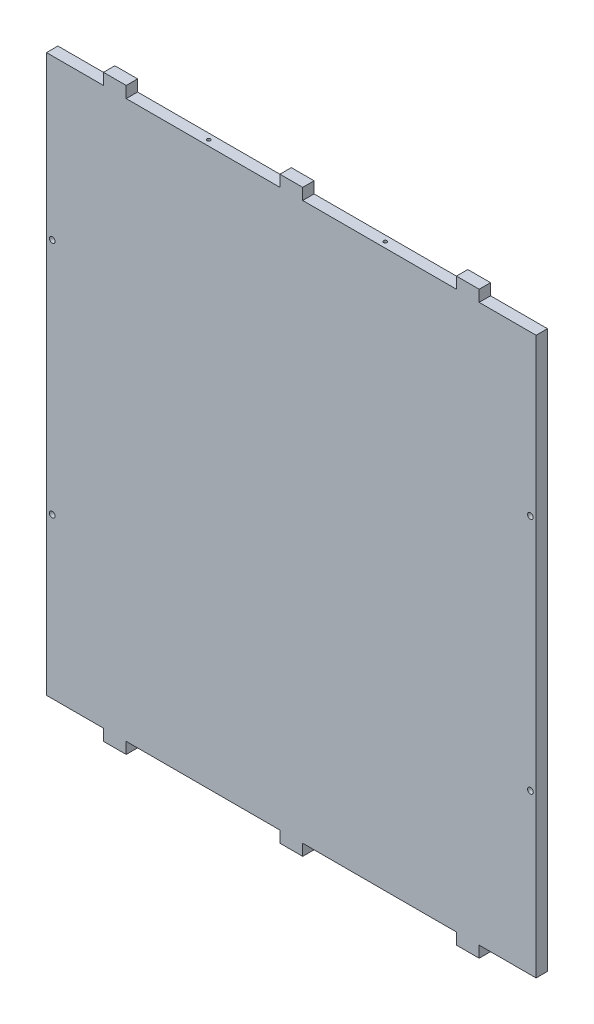
ISO-10303-21;
HEADER;
FILE_DESCRIPTION(('STEP AP214'),'2;1');
FILE_NAME('part.step','',(''),(''),'','','');
FILE_SCHEMA(('AUTOMOTIVE_DESIGN { 1 0 10303 214 1 1 1 1 }'));
ENDSEC;
DATA;
#1=APPLICATION_CONTEXT('core data for automotive mechanical design processes');
#2=APPLICATION_PROTOCOL_DEFINITION('international standard','automotive_design',2000,#1);
#3=PRODUCT_CONTEXT('',#1,'mechanical');
#4=PRODUCT('Part','Part','',(#3));
#5=PRODUCT_RELATED_PRODUCT_CATEGORY('part','',(#4));
#6=PRODUCT_DEFINITION_FORMATION('','',#4);
#7=PRODUCT_DEFINITION_CONTEXT('part definition',#1,'design');
#8=PRODUCT_DEFINITION('design','',#6,#7);
#9=PRODUCT_DEFINITION_SHAPE('','',#8);
#10=(LENGTH_UNIT() NAMED_UNIT(*) SI_UNIT(.MILLI.,.METRE.));
#11=(NAMED_UNIT(*) PLANE_ANGLE_UNIT() SI_UNIT($,.RADIAN.));
#12=(NAMED_UNIT(*) SI_UNIT($,.STERADIAN.) SOLID_ANGLE_UNIT());
#13=UNCERTAINTY_MEASURE_WITH_UNIT(LENGTH_MEASURE(1.E-05),#10,'distance_accuracy_value','');
#14=(GEOMETRIC_REPRESENTATION_CONTEXT(3) GLOBAL_UNCERTAINTY_ASSIGNED_CONTEXT((#13)) GLOBAL_UNIT_ASSIGNED_CONTEXT((#10,
#11,#12)) REPRESENTATION_CONTEXT('',''));
#15=CARTESIAN_POINT('',(0.,0.,0.));
#16=DIRECTION('',(0.,0.,1.));
#17=DIRECTION('',(1.,0.,0.));
#18=AXIS2_PLACEMENT_3D('',#15,#16,#17);
#19=CARTESIAN_POINT('',(30.5,177.225,5.));
#20=DIRECTION('',(0.,1.,0.));
#21=DIRECTION('',(0.,0.,1.));
#22=AXIS2_PLACEMENT_3D('',#19,#20,#21);
#23=PLANE('',#22);
#24=DIRECTION('',(0.,0.,1.));
#25=VECTOR('',#24,1.);
#26=CARTESIAN_POINT('',(-84.9999999999999,177.225,0.));
#27=LINE('',#26,#25);
#28=CARTESIAN_POINT('',(-84.9999999999999,177.225,0.));
#29=VERTEX_POINT('',#28);
#30=CARTESIAN_POINT('',(-84.9999999999999,177.225,5.));
#31=VERTEX_POINT('',#30);
#32=EDGE_CURVE('E311',#29,#31,#27,.T.);
#33=ORIENTED_EDGE('',*,*,#32,.F.);
#34=DIRECTION('',(1.,0.,0.));
#35=VECTOR('',#34,1.);
#36=CARTESIAN_POINT('',(30.5,177.225,0.));
#37=LINE('',#36,#35);
#38=CARTESIAN_POINT('',(-110.,177.225,0.));
#39=VERTEX_POINT('',#38);
#40=EDGE_CURVE('E461',#39,#29,#37,.T.);
#41=ORIENTED_EDGE('',*,*,#40,.F.);
#42=DIRECTION('',(0.,0.,-1.));
#43=VECTOR('',#42,1.);
#44=CARTESIAN_POINT('',(-110.,177.225,5.));
#45=LINE('',#44,#43);
#46=CARTESIAN_POINT('',(-110.,177.225,5.));
#47=VERTEX_POINT('',#46);
#48=EDGE_CURVE('E246',#47,#39,#45,.T.);
#49=ORIENTED_EDGE('',*,*,#48,.F.);
#50=DIRECTION('',(1.,0.,0.));
#51=VECTOR('',#50,1.);
#52=CARTESIAN_POINT('',(30.5,177.225,5.));
#53=LINE('',#52,#51);
#54=EDGE_CURVE('E242',#47,#31,#53,.T.);
#55=ORIENTED_EDGE('',*,*,#54,.T.);
#56=EDGE_LOOP('',(#33,#41,#49,#55));
#57=FACE_BOUND('',#56,.T.);
#58=ADVANCED_FACE('F37',(#57),#23,.T.);
#59=CARTESIAN_POINT('',(-41.25,177.225,2.5));
#60=DIRECTION('',(0.,1.,0.));
#61=DIRECTION('',(0.,0.,1.));
#62=AXIS2_PLACEMENT_3D('',#59,#60,#61);
#63=CIRCLE('',#62,0.749999999999999);
#64=CARTESIAN_POINT('',(-41.25,177.225,3.25));
#65=VERTEX_POINT('',#64);
#66=EDGE_CURVE('E278',#65,#65,#63,.T.);
#67=ORIENTED_EDGE('',*,*,#66,.F.);
#68=EDGE_LOOP('',(#67));
#69=FACE_BOUND('',#68,.T.);
#70=DIRECTION('',(0.,0.,1.));
#71=VECTOR('',#70,1.);
#72=CARTESIAN_POINT('',(-75.,177.225,0.));
#73=LINE('',#72,#71);
#74=CARTESIAN_POINT('',(-75.,177.225,0.));
#75=VERTEX_POINT('',#74);
#76=CARTESIAN_POINT('',(-75.,177.225,5.));
#77=VERTEX_POINT('',#76);
#78=EDGE_CURVE('E323',#75,#77,#73,.T.);
#79=ORIENTED_EDGE('',*,*,#78,.T.);
#80=CARTESIAN_POINT('',(-7.49999999999995,177.225,5.));
#81=VERTEX_POINT('',#80);
#82=EDGE_CURVE('E62',#77,#81,#53,.T.);
#83=ORIENTED_EDGE('',*,*,#82,.T.);
#84=DIRECTION('',(0.,0.,1.));
#85=VECTOR('',#84,1.);
#86=CARTESIAN_POINT('',(-7.49999999999995,177.225,0.));
#87=LINE('',#86,#85);
#88=CARTESIAN_POINT('',(-7.49999999999995,177.225,0.));
#89=VERTEX_POINT('',#88);
#90=EDGE_CURVE('E336',#89,#81,#87,.T.);
#91=ORIENTED_EDGE('',*,*,#90,.F.);
#92=EDGE_CURVE('E463',#75,#89,#37,.T.);
#93=ORIENTED_EDGE('',*,*,#92,.F.);
#94=EDGE_LOOP('',(#79,#83,#91,#93));
#95=FACE_BOUND('',#94,.T.);
#96=ADVANCED_FACE('F508',(#69,#95),#23,.T.);
#97=CARTESIAN_POINT('',(80.,177.225,0.));
#98=VERTEX_POINT('',#97);
#99=CARTESIAN_POINT('',(105.,177.225,0.));
#100=VERTEX_POINT('',#99);
#101=EDGE_CURVE('E452',#98,#100,#37,.T.);
#102=ORIENTED_EDGE('',*,*,#101,.F.);
#103=DIRECTION('',(0.,0.,1.));
#104=VECTOR('',#103,1.);
#105=CARTESIAN_POINT('',(80.,177.225,0.));
#106=LINE('',#105,#104);
#107=CARTESIAN_POINT('',(80.,177.225,5.));
#108=VERTEX_POINT('',#107);
#109=EDGE_CURVE('E376',#98,#108,#106,.T.);
#110=ORIENTED_EDGE('',*,*,#109,.T.);
#111=CARTESIAN_POINT('',(105.,177.225,5.));
#112=VERTEX_POINT('',#111);
#113=EDGE_CURVE('E460',#108,#112,#53,.T.);
#114=ORIENTED_EDGE('',*,*,#113,.T.);
#115=DIRECTION('',(0.,0.,-1.));
#116=VECTOR('',#115,1.);
#117=CARTESIAN_POINT('',(105.,177.225,5.));
#118=LINE('',#117,#116);
#119=EDGE_CURVE('E295',#112,#100,#118,.T.);
#120=ORIENTED_EDGE('',*,*,#119,.T.);
#121=EDGE_LOOP('',(#102,#110,#114,#120));
#122=FACE_BOUND('',#121,.T.);
#123=ADVANCED_FACE('F516',(#122),#23,.T.);
#124=CARTESIAN_POINT('',(0.,-67.225,5.));
#125=DIRECTION('',(0.,1.,0.));
#126=DIRECTION('',(-1.,0.,0.));
#127=AXIS2_PLACEMENT_3D('',#124,#125,#126);
#128=PLANE('',#127);
#129=CARTESIAN_POINT('',(36.25,-67.225,2.5));
#130=DIRECTION('',(0.,1.,0.));
#131=DIRECTION('',(0.,0.,1.));
#132=AXIS2_PLACEMENT_3D('',#129,#130,#131);
#133=CIRCLE('',#132,0.749999999999999);
#134=CARTESIAN_POINT('',(36.25,-67.225,3.25));
#135=VERTEX_POINT('',#134);
#136=EDGE_CURVE('E261',#135,#135,#133,.T.);
#137=ORIENTED_EDGE('',*,*,#136,.T.);
#138=EDGE_LOOP('',(#137));
#139=FACE_BOUND('',#138,.T.);
#140=DIRECTION('',(1.,0.,0.));
#141=VECTOR('',#140,1.);
#142=CARTESIAN_POINT('',(0.,-67.225,0.));
#143=LINE('',#142,#141);
#144=CARTESIAN_POINT('',(2.50000000000003,-67.225,0.));
#145=VERTEX_POINT('',#144);
#146=CARTESIAN_POINT('',(70.,-67.225,0.));
#147=VERTEX_POINT('',#146);
#148=EDGE_CURVE('E467',#145,#147,#143,.T.);
#149=ORIENTED_EDGE('',*,*,#148,.T.);
#150=DIRECTION('',(0.,0.,1.));
#151=VECTOR('',#150,1.);
#152=CARTESIAN_POINT('',(70.,-67.225,0.));
#153=LINE('',#152,#151);
#154=CARTESIAN_POINT('',(70.,-67.225,5.));
#155=VERTEX_POINT('',#154);
#156=EDGE_CURVE('E399',#147,#155,#153,.T.);
#157=ORIENTED_EDGE('',*,*,#156,.T.);
#158=DIRECTION('',(1.,0.,0.));
#159=VECTOR('',#158,1.);
#160=CARTESIAN_POINT('',(0.,-67.225,5.));
#161=LINE('',#160,#159);
#162=CARTESIAN_POINT('',(2.50000000000003,-67.225,5.));
#163=VERTEX_POINT('',#162);
#164=EDGE_CURVE('E489',#163,#155,#161,.T.);
#165=ORIENTED_EDGE('',*,*,#164,.F.);
#166=DIRECTION('',(0.,0.,1.));
#167=VECTOR('',#166,1.);
#168=CARTESIAN_POINT('',(2.50000000000003,-67.225,0.));
#169=LINE('',#168,#167);
#170=EDGE_CURVE('E429',#145,#163,#169,.T.);
#171=ORIENTED_EDGE('',*,*,#170,.F.);
#172=EDGE_LOOP('',(#149,#157,#165,#171));
#173=FACE_BOUND('',#172,.T.);
#174=ADVANCED_FACE('F474',(#139,#173),#128,.F.);
#175=CARTESIAN_POINT('',(-41.25,-67.225,2.5));
#176=DIRECTION('',(0.,1.,0.));
#177=DIRECTION('',(0.,0.,1.));
#178=AXIS2_PLACEMENT_3D('',#175,#176,#177);
#179=CIRCLE('',#178,0.749999999999999);
#180=CARTESIAN_POINT('',(-41.25,-67.225,3.25));
#181=VERTEX_POINT('',#180);
#182=EDGE_CURVE('E266',#181,#181,#179,.T.);
#183=ORIENTED_EDGE('',*,*,#182,.T.);
#184=EDGE_LOOP('',(#183));
#185=FACE_BOUND('',#184,.T.);
#186=CARTESIAN_POINT('',(-75.,-67.225,0.));
#187=VERTEX_POINT('',#186);
#188=CARTESIAN_POINT('',(-7.49999999999995,-67.225,0.));
#189=VERTEX_POINT('',#188);
#190=EDGE_CURVE('E465',#187,#189,#143,.T.);
#191=ORIENTED_EDGE('',*,*,#190,.T.);
#192=DIRECTION('',(0.,0.,1.));
#193=VECTOR('',#192,1.);
#194=CARTESIAN_POINT('',(-7.49999999999995,-67.225,0.));
#195=LINE('',#194,#193);
#196=CARTESIAN_POINT('',(-7.49999999999995,-67.225,5.));
#197=VERTEX_POINT('',#196);
#198=EDGE_CURVE('E426',#189,#197,#195,.T.);
#199=ORIENTED_EDGE('',*,*,#198,.T.);
#200=CARTESIAN_POINT('',(-75.,-67.225,5.));
#201=VERTEX_POINT('',#200);
#202=EDGE_CURVE('E234',#201,#197,#161,.T.);
#203=ORIENTED_EDGE('',*,*,#202,.F.);
#204=DIRECTION('',(0.,0.,1.));
#205=VECTOR('',#204,1.);
#206=CARTESIAN_POINT('',(-75.,-67.225,0.));
#207=LINE('',#206,#205);
#208=EDGE_CURVE('E453',#187,#201,#207,.T.);
#209=ORIENTED_EDGE('',*,*,#208,.F.);
#210=EDGE_LOOP('',(#191,#199,#203,#209));
#211=FACE_BOUND('',#210,.T.);
#212=ADVANCED_FACE('F500',(#185,#211),#128,.F.);
#213=CARTESIAN_POINT('',(80.,-67.225,5.));
#214=VERTEX_POINT('',#213);
#215=CARTESIAN_POINT('',(105.,-67.225,5.));
#216=VERTEX_POINT('',#215);
#217=EDGE_CURVE('E236',#214,#216,#161,.T.);
#218=ORIENTED_EDGE('',*,*,#217,.F.);
#219=DIRECTION('',(0.,0.,1.));
#220=VECTOR('',#219,1.);
#221=CARTESIAN_POINT('',(80.,-67.2249999999999,0.));
#222=LINE('',#221,#220);
#223=CARTESIAN_POINT('',(80.,-67.2249999999999,0.));
#224=VERTEX_POINT('',#223);
#225=EDGE_CURVE('E402',#224,#214,#222,.T.);
#226=ORIENTED_EDGE('',*,*,#225,.F.);
#227=CARTESIAN_POINT('',(105.,-67.225,0.));
#228=VERTEX_POINT('',#227);
#229=EDGE_CURVE('E459',#224,#228,#143,.T.);
#230=ORIENTED_EDGE('',*,*,#229,.T.);
#231=DIRECTION('',(0.,0.,-1.));
#232=VECTOR('',#231,1.);
#233=CARTESIAN_POINT('',(105.,-67.225,5.));
#234=LINE('',#233,#232);
#235=EDGE_CURVE('E298',#216,#228,#234,.T.);
#236=ORIENTED_EDGE('',*,*,#235,.F.);
#237=EDGE_LOOP('',(#218,#226,#230,#236));
#238=FACE_BOUND('',#237,.T.);
#239=ADVANCED_FACE('F498',(#238),#128,.F.);
#240=CARTESIAN_POINT('',(-110.,-67.225,0.));
#241=VERTEX_POINT('',#240);
#242=CARTESIAN_POINT('',(-84.9999999999999,-67.225,0.));
#243=VERTEX_POINT('',#242);
#244=EDGE_CURVE('E464',#241,#243,#143,.T.);
#245=ORIENTED_EDGE('',*,*,#244,.T.);
#246=DIRECTION('',(0.,0.,1.));
#247=VECTOR('',#246,1.);
#248=CARTESIAN_POINT('',(-84.9999999999999,-67.225,0.));
#249=LINE('',#248,#247);
#250=CARTESIAN_POINT('',(-84.9999999999999,-67.225,5.));
#251=VERTEX_POINT('',#250);
#252=EDGE_CURVE('E231',#243,#251,#249,.T.);
#253=ORIENTED_EDGE('',*,*,#252,.T.);
#254=CARTESIAN_POINT('',(-110.,-67.225,5.));
#255=VERTEX_POINT('',#254);
#256=EDGE_CURVE('E46',#255,#251,#161,.T.);
#257=ORIENTED_EDGE('',*,*,#256,.F.);
#258=DIRECTION('',(0.,0.,1.));
#259=VECTOR('',#258,1.);
#260=CARTESIAN_POINT('',(-110.,-67.225,0.));
#261=LINE('',#260,#259);
#262=EDGE_CURVE('E230',#241,#255,#261,.T.);
#263=ORIENTED_EDGE('',*,*,#262,.F.);
#264=EDGE_LOOP('',(#245,#253,#257,#263));
#265=FACE_BOUND('',#264,.T.);
#266=ADVANCED_FACE('F39',(#265),#128,.F.);
#267=CARTESIAN_POINT('',(105.,-1.45716771982052E-13,5.));
#268=DIRECTION('',(1.,0.,0.));
#269=DIRECTION('',(0.,1.,0.));
#270=AXIS2_PLACEMENT_3D('',#267,#268,#269);
#271=PLANE('',#270);
#272=DIRECTION('',(0.,-1.,0.));
#273=VECTOR('',#272,1.);
#274=CARTESIAN_POINT('',(105.,-1.45716771982052E-13,0.));
#275=LINE('',#274,#273);
#276=EDGE_CURVE('E41',#100,#228,#275,.T.);
#277=ORIENTED_EDGE('',*,*,#276,.F.);
#278=ORIENTED_EDGE('',*,*,#119,.F.);
#279=DIRECTION('',(0.,1.,0.));
#280=VECTOR('',#279,1.);
#281=CARTESIAN_POINT('',(105.,1.45716771982052E-13,5.));
#282=LINE('',#281,#280);
#283=EDGE_CURVE('E11',#216,#112,#282,.T.);
#284=ORIENTED_EDGE('',*,*,#283,.F.);
#285=ORIENTED_EDGE('',*,*,#235,.T.);
#286=EDGE_LOOP('',(#277,#278,#284,#285));
#287=FACE_BOUND('',#286,.T.);
#288=ADVANCED_FACE('F497',(#287),#271,.T.);
#289=CARTESIAN_POINT('',(0.,0.,5.));
#290=DIRECTION('',(0.,0.,1.));
#291=DIRECTION('',(1.,0.,0.));
#292=AXIS2_PLACEMENT_3D('',#289,#290,#291);
#293=PLANE('',#292);
#294=CARTESIAN_POINT('',(-107.5,2.77500000000006,5.));
#295=DIRECTION('',(0.,0.,-1.));
#296=DIRECTION('',(-1.,0.,0.));
#297=AXIS2_PLACEMENT_3D('',#294,#295,#296);
#298=CIRCLE('',#297,1.25);
#299=CARTESIAN_POINT('',(-108.75,2.77500000000006,5.));
#300=VERTEX_POINT('',#299);
#301=EDGE_CURVE('E252',#300,#300,#298,.T.);
#302=ORIENTED_EDGE('',*,*,#301,.T.);
#303=EDGE_LOOP('',(#302));
#304=FACE_BOUND('',#303,.T.);
#305=CARTESIAN_POINT('',(-107.5,107.225,5.));
#306=DIRECTION('',(0.,0.,-1.));
#307=DIRECTION('',(-1.,0.,0.));
#308=AXIS2_PLACEMENT_3D('',#305,#306,#307);
#309=CIRCLE('',#308,1.25);
#310=CARTESIAN_POINT('',(-108.75,107.225,5.));
#311=VERTEX_POINT('',#310);
#312=EDGE_CURVE('E1082',#311,#311,#309,.T.);
#313=ORIENTED_EDGE('',*,*,#312,.T.);
#314=EDGE_LOOP('',(#313));
#315=FACE_BOUND('',#314,.T.);
#316=CARTESIAN_POINT('',(102.5,2.77500000000004,5.));
#317=DIRECTION('',(0.,0.,-1.));
#318=DIRECTION('',(1.,0.,0.));
#319=AXIS2_PLACEMENT_3D('',#316,#317,#318);
#320=CIRCLE('',#319,1.25);
#321=CARTESIAN_POINT('',(103.75,2.77500000000004,5.));
#322=VERTEX_POINT('',#321);
#323=EDGE_CURVE('E286',#322,#322,#320,.T.);
#324=ORIENTED_EDGE('',*,*,#323,.T.);
#325=EDGE_LOOP('',(#324));
#326=FACE_BOUND('',#325,.T.);
#327=CARTESIAN_POINT('',(102.5,107.225,5.));
#328=DIRECTION('',(0.,0.,-1.));
#329=DIRECTION('',(-1.,0.,0.));
#330=AXIS2_PLACEMENT_3D('',#327,#328,#329);
#331=CIRCLE('',#330,1.25);
#332=CARTESIAN_POINT('',(101.25,107.225,5.));
#333=VERTEX_POINT('',#332);
#334=EDGE_CURVE('E292',#333,#333,#331,.T.);
#335=ORIENTED_EDGE('',*,*,#334,.T.);
#336=EDGE_LOOP('',(#335));
#337=FACE_BOUND('',#336,.T.);
#338=ORIENTED_EDGE('',*,*,#283,.T.);
#339=ORIENTED_EDGE('',*,*,#113,.F.);
#340=DIRECTION('',(0.,1.,0.));
#341=VECTOR('',#340,1.);
#342=CARTESIAN_POINT('',(80.,177.225,5.));
#343=LINE('',#342,#341);
#344=CARTESIAN_POINT('',(80.,182.225,5.));
#345=VERTEX_POINT('',#344);
#346=EDGE_CURVE('E366',#108,#345,#343,.T.);
#347=ORIENTED_EDGE('',*,*,#346,.T.);
#348=DIRECTION('',(-1.,0.,0.));
#349=VECTOR('',#348,1.);
#350=CARTESIAN_POINT('',(70.,182.225,5.));
#351=LINE('',#350,#349);
#352=CARTESIAN_POINT('',(70.,182.225,5.));
#353=VERTEX_POINT('',#352);
#354=EDGE_CURVE('E357',#345,#353,#351,.T.);
#355=ORIENTED_EDGE('',*,*,#354,.T.);
#356=DIRECTION('',(0.,-1.,0.));
#357=VECTOR('',#356,1.);
#358=CARTESIAN_POINT('',(70.,177.225,5.));
#359=LINE('',#358,#357);
#360=CARTESIAN_POINT('',(70.,177.225,5.));
#361=VERTEX_POINT('',#360);
#362=EDGE_CURVE('E346',#353,#361,#359,.T.);
#363=ORIENTED_EDGE('',*,*,#362,.T.);
#364=CARTESIAN_POINT('',(2.50000000000003,177.225,5.));
#365=VERTEX_POINT('',#364);
#366=EDGE_CURVE('E559',#365,#361,#53,.T.);
#367=ORIENTED_EDGE('',*,*,#366,.F.);
#368=DIRECTION('',(0.,1.,0.));
#369=VECTOR('',#368,1.);
#370=CARTESIAN_POINT('',(2.50000000000003,177.225,5.));
#371=LINE('',#370,#369);
#372=CARTESIAN_POINT('',(2.50000000000003,182.225,5.));
#373=VERTEX_POINT('',#372);
#374=EDGE_CURVE('E339',#365,#373,#371,.T.);
#375=ORIENTED_EDGE('',*,*,#374,.T.);
#376=DIRECTION('',(-1.,0.,0.));
#377=VECTOR('',#376,1.);
#378=CARTESIAN_POINT('',(-7.49999999999995,182.225,5.));
#379=LINE('',#378,#377);
#380=CARTESIAN_POINT('',(-7.49999999999995,182.225,5.));
#381=VERTEX_POINT('',#380);
#382=EDGE_CURVE('E330',#373,#381,#379,.T.);
#383=ORIENTED_EDGE('',*,*,#382,.T.);
#384=DIRECTION('',(0.,-1.,0.));
#385=VECTOR('',#384,1.);
#386=CARTESIAN_POINT('',(-7.49999999999995,177.225,5.));
#387=LINE('',#386,#385);
#388=EDGE_CURVE('E320',#381,#81,#387,.T.);
#389=ORIENTED_EDGE('',*,*,#388,.T.);
#390=ORIENTED_EDGE('',*,*,#82,.F.);
#391=DIRECTION('',(0.,1.,0.));
#392=VECTOR('',#391,1.);
#393=CARTESIAN_POINT('',(-75.,177.225,5.));
#394=LINE('',#393,#392);
#395=CARTESIAN_POINT('',(-74.9999999999999,182.225,5.));
#396=VERTEX_POINT('',#395);
#397=EDGE_CURVE('E313',#77,#396,#394,.T.);
#398=ORIENTED_EDGE('',*,*,#397,.T.);
#399=DIRECTION('',(-1.,0.,0.));
#400=VECTOR('',#399,1.);
#401=CARTESIAN_POINT('',(-84.9999999999999,182.225,5.));
#402=LINE('',#401,#400);
#403=CARTESIAN_POINT('',(-84.9999999999999,182.225,5.));
#404=VERTEX_POINT('',#403);
#405=EDGE_CURVE('E306',#396,#404,#402,.T.);
#406=ORIENTED_EDGE('',*,*,#405,.T.);
#407=DIRECTION('',(0.,-1.,0.));
#408=VECTOR('',#407,1.);
#409=CARTESIAN_POINT('',(-84.9999999999999,177.225,5.));
#410=LINE('',#409,#408);
#411=EDGE_CURVE('E301',#404,#31,#410,.T.);
#412=ORIENTED_EDGE('',*,*,#411,.T.);
#413=ORIENTED_EDGE('',*,*,#54,.F.);
#414=DIRECTION('',(0.,1.,0.));
#415=VECTOR('',#414,1.);
#416=CARTESIAN_POINT('',(-110.,-67.225,5.));
#417=LINE('',#416,#415);
#418=EDGE_CURVE('E238',#255,#47,#417,.T.);
#419=ORIENTED_EDGE('',*,*,#418,.F.);
#420=ORIENTED_EDGE('',*,*,#256,.T.);
#421=DIRECTION('',(0.,-1.,0.));
#422=VECTOR('',#421,1.);
#423=CARTESIAN_POINT('',(-84.9999999999999,-67.225,5.));
#424=LINE('',#423,#422);
#425=CARTESIAN_POINT('',(-84.9999999999999,-72.225,5.));
#426=VERTEX_POINT('',#425);
#427=EDGE_CURVE('E428',#251,#426,#424,.T.);
#428=ORIENTED_EDGE('',*,*,#427,.T.);
#429=DIRECTION('',(1.,0.,0.));
#430=VECTOR('',#429,1.);
#431=CARTESIAN_POINT('',(-84.9999999999999,-72.225,5.));
#432=LINE('',#431,#430);
#433=CARTESIAN_POINT('',(-74.9999999999999,-72.225,5.));
#434=VERTEX_POINT('',#433);
#435=EDGE_CURVE('E446',#426,#434,#432,.T.);
#436=ORIENTED_EDGE('',*,*,#435,.T.);
#437=DIRECTION('',(0.,1.,0.));
#438=VECTOR('',#437,1.);
#439=CARTESIAN_POINT('',(-75.,-67.225,5.));
#440=LINE('',#439,#438);
#441=EDGE_CURVE('E439',#434,#201,#440,.T.);
#442=ORIENTED_EDGE('',*,*,#441,.T.);
#443=ORIENTED_EDGE('',*,*,#202,.T.);
#444=DIRECTION('',(0.,-1.,0.));
#445=VECTOR('',#444,1.);
#446=CARTESIAN_POINT('',(-7.49999999999995,-67.225,5.));
#447=LINE('',#446,#445);
#448=CARTESIAN_POINT('',(-7.49999999999995,-72.225,5.));
#449=VERTEX_POINT('',#448);
#450=EDGE_CURVE('E401',#197,#449,#447,.T.);
#451=ORIENTED_EDGE('',*,*,#450,.T.);
#452=DIRECTION('',(1.,0.,0.));
#453=VECTOR('',#452,1.);
#454=CARTESIAN_POINT('',(-7.49999999999995,-72.225,5.));
#455=LINE('',#454,#453);
#456=CARTESIAN_POINT('',(2.50000000000003,-72.225,5.));
#457=VERTEX_POINT('',#456);
#458=EDGE_CURVE('E421',#449,#457,#455,.T.);
#459=ORIENTED_EDGE('',*,*,#458,.T.);
#460=DIRECTION('',(0.,1.,0.));
#461=VECTOR('',#460,1.);
#462=CARTESIAN_POINT('',(2.50000000000003,-67.225,5.));
#463=LINE('',#462,#461);
#464=EDGE_CURVE('E412',#457,#163,#463,.T.);
#465=ORIENTED_EDGE('',*,*,#464,.T.);
#466=ORIENTED_EDGE('',*,*,#164,.T.);
#467=DIRECTION('',(0.,-1.,0.));
#468=VECTOR('',#467,1.);
#469=CARTESIAN_POINT('',(70.,-67.225,5.));
#470=LINE('',#469,#468);
#471=CARTESIAN_POINT('',(70.,-72.2249999999999,5.));
#472=VERTEX_POINT('',#471);
#473=EDGE_CURVE('E373',#155,#472,#470,.T.);
#474=ORIENTED_EDGE('',*,*,#473,.T.);
#475=DIRECTION('',(1.,0.,0.));
#476=VECTOR('',#475,1.);
#477=CARTESIAN_POINT('',(70.,-72.2249999999999,5.));
#478=LINE('',#477,#476);
#479=CARTESIAN_POINT('',(80.,-72.225,5.));
#480=VERTEX_POINT('',#479);
#481=EDGE_CURVE('E394',#472,#480,#478,.T.);
#482=ORIENTED_EDGE('',*,*,#481,.T.);
#483=DIRECTION('',(0.,1.,0.));
#484=VECTOR('',#483,1.);
#485=CARTESIAN_POINT('',(80.,-67.2249999999999,5.));
#486=LINE('',#485,#484);
#487=EDGE_CURVE('E385',#480,#214,#486,.T.);
#488=ORIENTED_EDGE('',*,*,#487,.T.);
#489=ORIENTED_EDGE('',*,*,#217,.T.);
#490=EDGE_LOOP('',(#338,#339,#347,#355,#363,#367,#375,#383,#389,#390,#398,#406,#412,#413,#419,
#420,#428,#436,#442,#443,#451,#459,#465,#466,#474,#482,#488,#489));
#491=FACE_BOUND('',#490,.T.);
#492=ADVANCED_FACE('F239',(#304,#315,#326,#337,#491),#293,.T.);
#493=CARTESIAN_POINT('',(0.,0.,0.));
#494=DIRECTION('',(0.,0.,1.));
#495=DIRECTION('',(1.,0.,0.));
#496=AXIS2_PLACEMENT_3D('',#493,#494,#495);
#497=PLANE('',#496);
#498=CARTESIAN_POINT('',(-107.5,2.77500000000006,0.));
#499=DIRECTION('',(0.,0.,-1.));
#500=DIRECTION('',(-1.,0.,0.));
#501=AXIS2_PLACEMENT_3D('',#498,#499,#500);
#502=CIRCLE('',#501,1.25);
#503=CARTESIAN_POINT('',(-108.75,2.77500000000006,0.));
#504=VERTEX_POINT('',#503);
#505=EDGE_CURVE('E255',#504,#504,#502,.T.);
#506=ORIENTED_EDGE('',*,*,#505,.F.);
#507=EDGE_LOOP('',(#506));
#508=FACE_BOUND('',#507,.T.);
#509=CARTESIAN_POINT('',(-107.5,107.225,0.));
#510=DIRECTION('',(0.,0.,-1.));
#511=DIRECTION('',(-1.,0.,0.));
#512=AXIS2_PLACEMENT_3D('',#509,#510,#511);
#513=CIRCLE('',#512,1.25);
#514=CARTESIAN_POINT('',(-108.75,107.225,0.));
#515=VERTEX_POINT('',#514);
#516=EDGE_CURVE('E1092',#515,#515,#513,.T.);
#517=ORIENTED_EDGE('',*,*,#516,.F.);
#518=EDGE_LOOP('',(#517));
#519=FACE_BOUND('',#518,.T.);
#520=CARTESIAN_POINT('',(102.5,2.77500000000004,0.));
#521=DIRECTION('',(0.,0.,-1.));
#522=DIRECTION('',(1.,0.,0.));
#523=AXIS2_PLACEMENT_3D('',#520,#521,#522);
#524=CIRCLE('',#523,1.25);
#525=CARTESIAN_POINT('',(103.75,2.77500000000004,0.));
#526=VERTEX_POINT('',#525);
#527=EDGE_CURVE('E277',#526,#526,#524,.T.);
#528=ORIENTED_EDGE('',*,*,#527,.F.);
#529=EDGE_LOOP('',(#528));
#530=FACE_BOUND('',#529,.T.);
#531=CARTESIAN_POINT('',(102.5,107.225,0.));
#532=DIRECTION('',(0.,0.,-1.));
#533=DIRECTION('',(-1.,0.,0.));
#534=AXIS2_PLACEMENT_3D('',#531,#532,#533);
#535=CIRCLE('',#534,1.25);
#536=CARTESIAN_POINT('',(101.25,107.225,0.));
#537=VERTEX_POINT('',#536);
#538=EDGE_CURVE('E289',#537,#537,#535,.T.);
#539=ORIENTED_EDGE('',*,*,#538,.F.);
#540=EDGE_LOOP('',(#539));
#541=FACE_BOUND('',#540,.T.);
#542=ORIENTED_EDGE('',*,*,#101,.T.);
#543=ORIENTED_EDGE('',*,*,#276,.T.);
#544=ORIENTED_EDGE('',*,*,#229,.F.);
#545=DIRECTION('',(0.,1.,0.));
#546=VECTOR('',#545,1.);
#547=CARTESIAN_POINT('',(80.,-67.2249999999999,0.));
#548=LINE('',#547,#546);
#549=CARTESIAN_POINT('',(80.,-72.225,0.));
#550=VERTEX_POINT('',#549);
#551=EDGE_CURVE('E388',#550,#224,#548,.T.);
#552=ORIENTED_EDGE('',*,*,#551,.F.);
#553=DIRECTION('',(1.,0.,0.));
#554=VECTOR('',#553,1.);
#555=CARTESIAN_POINT('',(70.,-72.2249999999999,0.));
#556=LINE('',#555,#554);
#557=CARTESIAN_POINT('',(70.,-72.2249999999999,0.));
#558=VERTEX_POINT('',#557);
#559=EDGE_CURVE('E384',#558,#550,#556,.T.);
#560=ORIENTED_EDGE('',*,*,#559,.F.);
#561=DIRECTION('',(0.,-1.,0.));
#562=VECTOR('',#561,1.);
#563=CARTESIAN_POINT('',(70.,-67.225,0.));
#564=LINE('',#563,#562);
#565=EDGE_CURVE('E381',#147,#558,#564,.T.);
#566=ORIENTED_EDGE('',*,*,#565,.F.);
#567=ORIENTED_EDGE('',*,*,#148,.F.);
#568=DIRECTION('',(0.,1.,0.));
#569=VECTOR('',#568,1.);
#570=CARTESIAN_POINT('',(2.50000000000003,-67.225,0.));
#571=LINE('',#570,#569);
#572=CARTESIAN_POINT('',(2.50000000000003,-72.225,0.));
#573=VERTEX_POINT('',#572);
#574=EDGE_CURVE('E415',#573,#145,#571,.T.);
#575=ORIENTED_EDGE('',*,*,#574,.F.);
#576=DIRECTION('',(1.,0.,0.));
#577=VECTOR('',#576,1.);
#578=CARTESIAN_POINT('',(-7.49999999999995,-72.225,0.));
#579=LINE('',#578,#577);
#580=CARTESIAN_POINT('',(-7.49999999999995,-72.225,0.));
#581=VERTEX_POINT('',#580);
#582=EDGE_CURVE('E411',#581,#573,#579,.T.);
#583=ORIENTED_EDGE('',*,*,#582,.F.);
#584=DIRECTION('',(0.,-1.,0.));
#585=VECTOR('',#584,1.);
#586=CARTESIAN_POINT('',(-7.49999999999995,-67.225,0.));
#587=LINE('',#586,#585);
#588=EDGE_CURVE('E408',#189,#581,#587,.T.);
#589=ORIENTED_EDGE('',*,*,#588,.F.);
#590=ORIENTED_EDGE('',*,*,#190,.F.);
#591=DIRECTION('',(0.,1.,0.));
#592=VECTOR('',#591,1.);
#593=CARTESIAN_POINT('',(-75.,-67.225,0.));
#594=LINE('',#593,#592);
#595=CARTESIAN_POINT('',(-74.9999999999999,-72.225,0.));
#596=VERTEX_POINT('',#595);
#597=EDGE_CURVE('E442',#596,#187,#594,.T.);
#598=ORIENTED_EDGE('',*,*,#597,.F.);
#599=DIRECTION('',(1.,0.,0.));
#600=VECTOR('',#599,1.);
#601=CARTESIAN_POINT('',(-84.9999999999999,-72.225,0.));
#602=LINE('',#601,#600);
#603=CARTESIAN_POINT('',(-84.9999999999999,-72.225,0.));
#604=VERTEX_POINT('',#603);
#605=EDGE_CURVE('E438',#604,#596,#602,.T.);
#606=ORIENTED_EDGE('',*,*,#605,.F.);
#607=DIRECTION('',(0.,-1.,0.));
#608=VECTOR('',#607,1.);
#609=CARTESIAN_POINT('',(-84.9999999999999,-67.225,0.));
#610=LINE('',#609,#608);
#611=EDGE_CURVE('E435',#243,#604,#610,.T.);
#612=ORIENTED_EDGE('',*,*,#611,.F.);
#613=ORIENTED_EDGE('',*,*,#244,.F.);
#614=DIRECTION('',(0.,-1.,0.));
#615=VECTOR('',#614,1.);
#616=CARTESIAN_POINT('',(-110.,177.225,0.));
#617=LINE('',#616,#615);
#618=EDGE_CURVE('E251',#39,#241,#617,.T.);
#619=ORIENTED_EDGE('',*,*,#618,.F.);
#620=ORIENTED_EDGE('',*,*,#40,.T.);
#621=DIRECTION('',(0.,-1.,0.));
#622=VECTOR('',#621,1.);
#623=CARTESIAN_POINT('',(-84.9999999999999,177.225,0.));
#624=LINE('',#623,#622);
#625=CARTESIAN_POINT('',(-84.9999999999999,182.225,0.));
#626=VERTEX_POINT('',#625);
#627=EDGE_CURVE('E304',#626,#29,#624,.T.);
#628=ORIENTED_EDGE('',*,*,#627,.F.);
#629=DIRECTION('',(-1.,0.,0.));
#630=VECTOR('',#629,1.);
#631=CARTESIAN_POINT('',(-84.9999999999999,182.225,0.));
#632=LINE('',#631,#630);
#633=CARTESIAN_POINT('',(-74.9999999999999,182.225,0.));
#634=VERTEX_POINT('',#633);
#635=EDGE_CURVE('E308',#634,#626,#632,.T.);
#636=ORIENTED_EDGE('',*,*,#635,.F.);
#637=DIRECTION('',(0.,1.,0.));
#638=VECTOR('',#637,1.);
#639=CARTESIAN_POINT('',(-75.,177.225,0.));
#640=LINE('',#639,#638);
#641=EDGE_CURVE('E54',#75,#634,#640,.T.);
#642=ORIENTED_EDGE('',*,*,#641,.F.);
#643=ORIENTED_EDGE('',*,*,#92,.T.);
#644=DIRECTION('',(0.,-1.,0.));
#645=VECTOR('',#644,1.);
#646=CARTESIAN_POINT('',(-7.49999999999995,177.225,0.));
#647=LINE('',#646,#645);
#648=CARTESIAN_POINT('',(-7.49999999999995,182.225,0.));
#649=VERTEX_POINT('',#648);
#650=EDGE_CURVE('E326',#649,#89,#647,.T.);
#651=ORIENTED_EDGE('',*,*,#650,.F.);
#652=DIRECTION('',(-1.,0.,0.));
#653=VECTOR('',#652,1.);
#654=CARTESIAN_POINT('',(-7.49999999999995,182.225,0.));
#655=LINE('',#654,#653);
#656=CARTESIAN_POINT('',(2.50000000000003,182.225,0.));
#657=VERTEX_POINT('',#656);
#658=EDGE_CURVE('E333',#657,#649,#655,.T.);
#659=ORIENTED_EDGE('',*,*,#658,.F.);
#660=DIRECTION('',(0.,1.,0.));
#661=VECTOR('',#660,1.);
#662=CARTESIAN_POINT('',(2.50000000000003,177.225,0.));
#663=LINE('',#662,#661);
#664=CARTESIAN_POINT('',(2.50000000000003,177.225,0.));
#665=VERTEX_POINT('',#664);
#666=EDGE_CURVE('E329',#665,#657,#663,.T.);
#667=ORIENTED_EDGE('',*,*,#666,.F.);
#668=CARTESIAN_POINT('',(70.,177.225,0.));
#669=VERTEX_POINT('',#668);
#670=EDGE_CURVE('E542',#665,#669,#37,.T.);
#671=ORIENTED_EDGE('',*,*,#670,.T.);
#672=DIRECTION('',(0.,-1.,0.));
#673=VECTOR('',#672,1.);
#674=CARTESIAN_POINT('',(70.,177.225,0.));
#675=LINE('',#674,#673);
#676=CARTESIAN_POINT('',(70.,182.225,0.));
#677=VERTEX_POINT('',#676);
#678=EDGE_CURVE('E353',#677,#669,#675,.T.);
#679=ORIENTED_EDGE('',*,*,#678,.F.);
#680=DIRECTION('',(-1.,0.,0.));
#681=VECTOR('',#680,1.);
#682=CARTESIAN_POINT('',(70.,182.225,0.));
#683=LINE('',#682,#681);
#684=CARTESIAN_POINT('',(80.,182.225,0.));
#685=VERTEX_POINT('',#684);
#686=EDGE_CURVE('E360',#685,#677,#683,.T.);
#687=ORIENTED_EDGE('',*,*,#686,.F.);
#688=DIRECTION('',(0.,1.,0.));
#689=VECTOR('',#688,1.);
#690=CARTESIAN_POINT('',(80.,177.225,0.));
#691=LINE('',#690,#689);
#692=EDGE_CURVE('E356',#98,#685,#691,.T.);
#693=ORIENTED_EDGE('',*,*,#692,.F.);
#694=EDGE_LOOP('',(#542,#543,#544,#552,#560,#566,#567,#575,#583,#589,#590,#598,#606,#612,#613,
#619,#620,#628,#636,#642,#643,#651,#659,#667,#671,#679,#687,#693));
#695=FACE_BOUND('',#694,.T.);
#696=ADVANCED_FACE('F483',(#508,#519,#530,#541,#695),#497,.F.);
#697=CARTESIAN_POINT('',(36.25,177.225,2.5));
#698=DIRECTION('',(0.,1.,0.));
#699=DIRECTION('',(0.,0.,1.));
#700=AXIS2_PLACEMENT_3D('',#697,#698,#699);
#701=CIRCLE('',#700,0.749999999999999);
#702=CARTESIAN_POINT('',(36.25,177.225,3.25));
#703=VERTEX_POINT('',#702);
#704=EDGE_CURVE('E265',#703,#703,#701,.T.);
#705=ORIENTED_EDGE('',*,*,#704,.F.);
#706=EDGE_LOOP('',(#705));
#707=FACE_BOUND('',#706,.T.);
#708=DIRECTION('',(0.,0.,1.));
#709=VECTOR('',#708,1.);
#710=CARTESIAN_POINT('',(2.50000000000003,177.225,0.));
#711=LINE('',#710,#709);
#712=EDGE_CURVE('E349',#665,#365,#711,.T.);
#713=ORIENTED_EDGE('',*,*,#712,.T.);
#714=ORIENTED_EDGE('',*,*,#366,.T.);
#715=DIRECTION('',(0.,0.,1.));
#716=VECTOR('',#715,1.);
#717=CARTESIAN_POINT('',(70.,177.225,0.));
#718=LINE('',#717,#716);
#719=EDGE_CURVE('E363',#669,#361,#718,.T.);
#720=ORIENTED_EDGE('',*,*,#719,.F.);
#721=ORIENTED_EDGE('',*,*,#670,.F.);
#722=EDGE_LOOP('',(#713,#714,#720,#721));
#723=FACE_BOUND('',#722,.T.);
#724=ADVANCED_FACE('F511',(#707,#723),#23,.T.);
#725=CARTESIAN_POINT('',(-84.9999999999999,-67.225,0.));
#726=DIRECTION('',(-1.,0.,0.));
#727=DIRECTION('',(0.,0.,1.));
#728=AXIS2_PLACEMENT_3D('',#725,#726,#727);
#729=PLANE('',#728);
#730=ORIENTED_EDGE('',*,*,#427,.F.);
#731=ORIENTED_EDGE('',*,*,#252,.F.);
#732=ORIENTED_EDGE('',*,*,#611,.T.);
#733=DIRECTION('',(0.,0.,1.));
#734=VECTOR('',#733,1.);
#735=CARTESIAN_POINT('',(-84.9999999999999,-72.225,0.));
#736=LINE('',#735,#734);
#737=EDGE_CURVE('E444',#604,#426,#736,.T.);
#738=ORIENTED_EDGE('',*,*,#737,.T.);
#739=EDGE_LOOP('',(#730,#731,#732,#738));
#740=FACE_BOUND('',#739,.T.);
#741=ADVANCED_FACE('F522',(#740),#729,.T.);
#742=CARTESIAN_POINT('',(-75.,-67.225,0.));
#743=DIRECTION('',(1.,0.,0.));
#744=DIRECTION('',(0.,1.,0.));
#745=AXIS2_PLACEMENT_3D('',#742,#743,#744);
#746=PLANE('',#745);
#747=ORIENTED_EDGE('',*,*,#441,.F.);
#748=DIRECTION('',(0.,0.,1.));
#749=VECTOR('',#748,1.);
#750=CARTESIAN_POINT('',(-74.9999999999999,-72.225,0.));
#751=LINE('',#750,#749);
#752=EDGE_CURVE('E455',#596,#434,#751,.T.);
#753=ORIENTED_EDGE('',*,*,#752,.F.);
#754=ORIENTED_EDGE('',*,*,#597,.T.);
#755=ORIENTED_EDGE('',*,*,#208,.T.);
#756=EDGE_LOOP('',(#747,#753,#754,#755));
#757=FACE_BOUND('',#756,.T.);
#758=ADVANCED_FACE('F527',(#757),#746,.T.);
#759=CARTESIAN_POINT('',(-84.9999999999999,-72.225,0.));
#760=DIRECTION('',(0.,-1.,0.));
#761=DIRECTION('',(0.,0.,-1.));
#762=AXIS2_PLACEMENT_3D('',#759,#760,#761);
#763=PLANE('',#762);
#764=ORIENTED_EDGE('',*,*,#435,.F.);
#765=ORIENTED_EDGE('',*,*,#737,.F.);
#766=ORIENTED_EDGE('',*,*,#605,.T.);
#767=ORIENTED_EDGE('',*,*,#752,.T.);
#768=EDGE_LOOP('',(#764,#765,#766,#767));
#769=FACE_BOUND('',#768,.T.);
#770=ADVANCED_FACE('F599',(#769),#763,.T.);
#771=CARTESIAN_POINT('',(-7.49999999999995,-67.225,0.));
#772=DIRECTION('',(-1.,0.,0.));
#773=DIRECTION('',(0.,-1.,0.));
#774=AXIS2_PLACEMENT_3D('',#771,#772,#773);
#775=PLANE('',#774);
#776=ORIENTED_EDGE('',*,*,#450,.F.);
#777=ORIENTED_EDGE('',*,*,#198,.F.);
#778=ORIENTED_EDGE('',*,*,#588,.T.);
#779=DIRECTION('',(0.,0.,1.));
#780=VECTOR('',#779,1.);
#781=CARTESIAN_POINT('',(-7.49999999999995,-72.225,0.));
#782=LINE('',#781,#780);
#783=EDGE_CURVE('E418',#581,#449,#782,.T.);
#784=ORIENTED_EDGE('',*,*,#783,.T.);
#785=EDGE_LOOP('',(#776,#777,#778,#784));
#786=FACE_BOUND('',#785,.T.);
#787=ADVANCED_FACE('F592',(#786),#775,.T.);
#788=CARTESIAN_POINT('',(2.50000000000003,-67.225,0.));
#789=DIRECTION('',(1.,0.,0.));
#790=DIRECTION('',(0.,1.,0.));
#791=AXIS2_PLACEMENT_3D('',#788,#789,#790);
#792=PLANE('',#791);
#793=ORIENTED_EDGE('',*,*,#464,.F.);
#794=DIRECTION('',(0.,0.,1.));
#795=VECTOR('',#794,1.);
#796=CARTESIAN_POINT('',(2.50000000000003,-72.225,0.));
#797=LINE('',#796,#795);
#798=EDGE_CURVE('E432',#573,#457,#797,.T.);
#799=ORIENTED_EDGE('',*,*,#798,.F.);
#800=ORIENTED_EDGE('',*,*,#574,.T.);
#801=ORIENTED_EDGE('',*,*,#170,.T.);
#802=EDGE_LOOP('',(#793,#799,#800,#801));
#803=FACE_BOUND('',#802,.T.);
#804=ADVANCED_FACE('F589',(#803),#792,.T.);
#805=CARTESIAN_POINT('',(-7.49999999999995,-72.225,0.));
#806=DIRECTION('',(0.,-1.,0.));
#807=DIRECTION('',(0.,0.,-1.));
#808=AXIS2_PLACEMENT_3D('',#805,#806,#807);
#809=PLANE('',#808);
#810=ORIENTED_EDGE('',*,*,#458,.F.);
#811=ORIENTED_EDGE('',*,*,#783,.F.);
#812=ORIENTED_EDGE('',*,*,#582,.T.);
#813=ORIENTED_EDGE('',*,*,#798,.T.);
#814=EDGE_LOOP('',(#810,#811,#812,#813));
#815=FACE_BOUND('',#814,.T.);
#816=ADVANCED_FACE('F588',(#815),#809,.T.);
#817=CARTESIAN_POINT('',(70.,-67.225,0.));
#818=DIRECTION('',(-1.,0.,0.));
#819=DIRECTION('',(0.,0.,1.));
#820=AXIS2_PLACEMENT_3D('',#817,#818,#819);
#821=PLANE('',#820);
#822=ORIENTED_EDGE('',*,*,#473,.F.);
#823=ORIENTED_EDGE('',*,*,#156,.F.);
#824=ORIENTED_EDGE('',*,*,#565,.T.);
#825=DIRECTION('',(0.,0.,1.));
#826=VECTOR('',#825,1.);
#827=CARTESIAN_POINT('',(70.,-72.2249999999999,0.));
#828=LINE('',#827,#826);
#829=EDGE_CURVE('E391',#558,#472,#828,.T.);
#830=ORIENTED_EDGE('',*,*,#829,.T.);
#831=EDGE_LOOP('',(#822,#823,#824,#830));
#832=FACE_BOUND('',#831,.T.);
#833=ADVANCED_FACE('F480',(#832),#821,.T.);
#834=CARTESIAN_POINT('',(80.,-67.2249999999999,0.));
#835=DIRECTION('',(1.,0.,0.));
#836=DIRECTION('',(0.,0.,-1.));
#837=AXIS2_PLACEMENT_3D('',#834,#835,#836);
#838=PLANE('',#837);
#839=ORIENTED_EDGE('',*,*,#487,.F.);
#840=DIRECTION('',(0.,0.,1.));
#841=VECTOR('',#840,1.);
#842=CARTESIAN_POINT('',(80.,-72.225,0.));
#843=LINE('',#842,#841);
#844=EDGE_CURVE('E405',#550,#480,#843,.T.);
#845=ORIENTED_EDGE('',*,*,#844,.F.);
#846=ORIENTED_EDGE('',*,*,#551,.T.);
#847=ORIENTED_EDGE('',*,*,#225,.T.);
#848=EDGE_LOOP('',(#839,#845,#846,#847));
#849=FACE_BOUND('',#848,.T.);
#850=ADVANCED_FACE('F580',(#849),#838,.T.);
#851=CARTESIAN_POINT('',(70.,-72.2249999999999,0.));
#852=DIRECTION('',(0.,-1.,0.));
#853=DIRECTION('',(1.,0.,0.));
#854=AXIS2_PLACEMENT_3D('',#851,#852,#853);
#855=PLANE('',#854);
#856=ORIENTED_EDGE('',*,*,#481,.F.);
#857=ORIENTED_EDGE('',*,*,#829,.F.);
#858=ORIENTED_EDGE('',*,*,#559,.T.);
#859=ORIENTED_EDGE('',*,*,#844,.T.);
#860=EDGE_LOOP('',(#856,#857,#858,#859));
#861=FACE_BOUND('',#860,.T.);
#862=ADVANCED_FACE('F487',(#861),#855,.T.);
#863=CARTESIAN_POINT('',(70.,177.225,0.));
#864=DIRECTION('',(-1.,0.,0.));
#865=DIRECTION('',(0.,0.,1.));
#866=AXIS2_PLACEMENT_3D('',#863,#864,#865);
#867=PLANE('',#866);
#868=ORIENTED_EDGE('',*,*,#362,.F.);
#869=DIRECTION('',(0.,0.,1.));
#870=VECTOR('',#869,1.);
#871=CARTESIAN_POINT('',(70.,182.225,0.));
#872=LINE('',#871,#870);
#873=EDGE_CURVE('E371',#677,#353,#872,.T.);
#874=ORIENTED_EDGE('',*,*,#873,.F.);
#875=ORIENTED_EDGE('',*,*,#678,.T.);
#876=ORIENTED_EDGE('',*,*,#719,.T.);
#877=EDGE_LOOP('',(#868,#874,#875,#876));
#878=FACE_BOUND('',#877,.T.);
#879=ADVANCED_FACE('F562',(#878),#867,.T.);
#880=CARTESIAN_POINT('',(70.,182.225,0.));
#881=DIRECTION('',(0.,1.,0.));
#882=DIRECTION('',(-1.,0.,0.));
#883=AXIS2_PLACEMENT_3D('',#880,#881,#882);
#884=PLANE('',#883);
#885=ORIENTED_EDGE('',*,*,#354,.F.);
#886=DIRECTION('',(0.,0.,1.));
#887=VECTOR('',#886,1.);
#888=CARTESIAN_POINT('',(80.,182.225,0.));
#889=LINE('',#888,#887);
#890=EDGE_CURVE('E374',#685,#345,#889,.T.);
#891=ORIENTED_EDGE('',*,*,#890,.F.);
#892=ORIENTED_EDGE('',*,*,#686,.T.);
#893=ORIENTED_EDGE('',*,*,#873,.T.);
#894=EDGE_LOOP('',(#885,#891,#892,#893));
#895=FACE_BOUND('',#894,.T.);
#896=ADVANCED_FACE('F565',(#895),#884,.T.);
#897=CARTESIAN_POINT('',(80.,177.225,0.));
#898=DIRECTION('',(1.,0.,0.));
#899=DIRECTION('',(0.,0.,-1.));
#900=AXIS2_PLACEMENT_3D('',#897,#898,#899);
#901=PLANE('',#900);
#902=ORIENTED_EDGE('',*,*,#346,.F.);
#903=ORIENTED_EDGE('',*,*,#109,.F.);
#904=ORIENTED_EDGE('',*,*,#692,.T.);
#905=ORIENTED_EDGE('',*,*,#890,.T.);
#906=EDGE_LOOP('',(#902,#903,#904,#905));
#907=FACE_BOUND('',#906,.T.);
#908=ADVANCED_FACE('F568',(#907),#901,.T.);
#909=CARTESIAN_POINT('',(-7.49999999999995,177.225,0.));
#910=DIRECTION('',(-1.,0.,0.));
#911=DIRECTION('',(0.,-1.,0.));
#912=AXIS2_PLACEMENT_3D('',#909,#910,#911);
#913=PLANE('',#912);
#914=ORIENTED_EDGE('',*,*,#388,.F.);
#915=DIRECTION('',(0.,0.,1.));
#916=VECTOR('',#915,1.);
#917=CARTESIAN_POINT('',(-7.49999999999995,182.225,0.));
#918=LINE('',#917,#916);
#919=EDGE_CURVE('E344',#649,#381,#918,.T.);
#920=ORIENTED_EDGE('',*,*,#919,.F.);
#921=ORIENTED_EDGE('',*,*,#650,.T.);
#922=ORIENTED_EDGE('',*,*,#90,.T.);
#923=EDGE_LOOP('',(#914,#920,#921,#922));
#924=FACE_BOUND('',#923,.T.);
#925=ADVANCED_FACE('F550',(#924),#913,.T.);
#926=CARTESIAN_POINT('',(-7.49999999999995,182.225,0.));
#927=DIRECTION('',(0.,1.,0.));
#928=DIRECTION('',(0.,0.,1.));
#929=AXIS2_PLACEMENT_3D('',#926,#927,#928);
#930=PLANE('',#929);
#931=ORIENTED_EDGE('',*,*,#382,.F.);
#932=DIRECTION('',(0.,0.,1.));
#933=VECTOR('',#932,1.);
#934=CARTESIAN_POINT('',(2.50000000000003,182.225,0.));
#935=LINE('',#934,#933);
#936=EDGE_CURVE('E347',#657,#373,#935,.T.);
#937=ORIENTED_EDGE('',*,*,#936,.F.);
#938=ORIENTED_EDGE('',*,*,#658,.T.);
#939=ORIENTED_EDGE('',*,*,#919,.T.);
#940=EDGE_LOOP('',(#931,#937,#938,#939));
#941=FACE_BOUND('',#940,.T.);
#942=ADVANCED_FACE('F553',(#941),#930,.T.);
#943=CARTESIAN_POINT('',(2.50000000000003,177.225,0.));
#944=DIRECTION('',(1.,0.,0.));
#945=DIRECTION('',(0.,1.,0.));
#946=AXIS2_PLACEMENT_3D('',#943,#944,#945);
#947=PLANE('',#946);
#948=ORIENTED_EDGE('',*,*,#374,.F.);
#949=ORIENTED_EDGE('',*,*,#712,.F.);
#950=ORIENTED_EDGE('',*,*,#666,.T.);
#951=ORIENTED_EDGE('',*,*,#936,.T.);
#952=EDGE_LOOP('',(#948,#949,#950,#951));
#953=FACE_BOUND('',#952,.T.);
#954=ADVANCED_FACE('F557',(#953),#947,.T.);
#955=CARTESIAN_POINT('',(-84.9999999999999,177.225,0.));
#956=DIRECTION('',(-1.,0.,0.));
#957=DIRECTION('',(0.,0.,1.));
#958=AXIS2_PLACEMENT_3D('',#955,#956,#957);
#959=PLANE('',#958);
#960=ORIENTED_EDGE('',*,*,#411,.F.);
#961=DIRECTION('',(0.,0.,1.));
#962=VECTOR('',#961,1.);
#963=CARTESIAN_POINT('',(-84.9999999999999,182.225,0.));
#964=LINE('',#963,#962);
#965=EDGE_CURVE('E318',#626,#404,#964,.T.);
#966=ORIENTED_EDGE('',*,*,#965,.F.);
#967=ORIENTED_EDGE('',*,*,#627,.T.);
#968=ORIENTED_EDGE('',*,*,#32,.T.);
#969=EDGE_LOOP('',(#960,#966,#967,#968));
#970=FACE_BOUND('',#969,.T.);
#971=ADVANCED_FACE('F625',(#970),#959,.T.);
#972=CARTESIAN_POINT('',(-84.9999999999999,182.225,0.));
#973=DIRECTION('',(0.,1.,0.));
#974=DIRECTION('',(0.,0.,1.));
#975=AXIS2_PLACEMENT_3D('',#972,#973,#974);
#976=PLANE('',#975);
#977=ORIENTED_EDGE('',*,*,#405,.F.);
#978=DIRECTION('',(0.,0.,1.));
#979=VECTOR('',#978,1.);
#980=CARTESIAN_POINT('',(-74.9999999999999,182.225,0.));
#981=LINE('',#980,#979);
#982=EDGE_CURVE('E321',#634,#396,#981,.T.);
#983=ORIENTED_EDGE('',*,*,#982,.F.);
#984=ORIENTED_EDGE('',*,*,#635,.T.);
#985=ORIENTED_EDGE('',*,*,#965,.T.);
#986=EDGE_LOOP('',(#977,#983,#984,#985));
#987=FACE_BOUND('',#986,.T.);
#988=ADVANCED_FACE('F628',(#987),#976,.T.);
#989=CARTESIAN_POINT('',(-75.,177.225,0.));
#990=DIRECTION('',(1.,0.,0.));
#991=DIRECTION('',(0.,1.,0.));
#992=AXIS2_PLACEMENT_3D('',#989,#990,#991);
#993=PLANE('',#992);
#994=ORIENTED_EDGE('',*,*,#397,.F.);
#995=ORIENTED_EDGE('',*,*,#78,.F.);
#996=ORIENTED_EDGE('',*,*,#641,.T.);
#997=ORIENTED_EDGE('',*,*,#982,.T.);
#998=EDGE_LOOP('',(#994,#995,#996,#997));
#999=FACE_BOUND('',#998,.T.);
#1000=ADVANCED_FACE('F630',(#999),#993,.T.);
#1001=CARTESIAN_POINT('',(102.5,107.225,5.));
#1002=DIRECTION('',(0.,0.,-1.));
#1003=DIRECTION('',(-1.,0.,0.));
#1004=AXIS2_PLACEMENT_3D('',#1001,#1002,#1003);
#1005=CYLINDRICAL_SURFACE('',#1004,1.25);
#1006=ORIENTED_EDGE('',*,*,#334,.F.);
#1007=EDGE_LOOP('',(#1006));
#1008=FACE_BOUND('',#1007,.T.);
#1009=ORIENTED_EDGE('',*,*,#538,.T.);
#1010=EDGE_LOOP('',(#1009));
#1011=FACE_BOUND('',#1010,.T.);
#1012=ADVANCED_FACE('F632',(#1008,#1011),#1005,.F.);
#1013=CARTESIAN_POINT('',(102.5,2.77500000000004,5.));
#1014=DIRECTION('',(0.,0.,-1.));
#1015=DIRECTION('',(-1.,0.,0.));
#1016=AXIS2_PLACEMENT_3D('',#1013,#1014,#1015);
#1017=CYLINDRICAL_SURFACE('',#1016,1.25);
#1018=ORIENTED_EDGE('',*,*,#323,.F.);
#1019=EDGE_LOOP('',(#1018));
#1020=FACE_BOUND('',#1019,.T.);
#1021=ORIENTED_EDGE('',*,*,#527,.T.);
#1022=EDGE_LOOP('',(#1021));
#1023=FACE_BOUND('',#1022,.T.);
#1024=ADVANCED_FACE('F638',(#1020,#1023),#1017,.F.);
#1025=CARTESIAN_POINT('',(36.25,167.225,2.5));
#1026=DIRECTION('',(0.,1.,0.));
#1027=DIRECTION('',(0.,0.,1.));
#1028=AXIS2_PLACEMENT_3D('',#1025,#1026,#1027);
#1029=CYLINDRICAL_SURFACE('',#1028,0.749999999999999);
#1030=CARTESIAN_POINT('',(36.25,167.225,2.5));
#1031=DIRECTION('',(0.,1.,0.));
#1032=DIRECTION('',(0.,0.,1.));
#1033=AXIS2_PLACEMENT_3D('',#1030,#1031,#1032);
#1034=CIRCLE('',#1033,0.749999999999999);
#1035=CARTESIAN_POINT('',(36.25,167.225,3.25));
#1036=VERTEX_POINT('',#1035);
#1037=EDGE_CURVE('E281',#1036,#1036,#1034,.T.);
#1038=ORIENTED_EDGE('',*,*,#1037,.F.);
#1039=EDGE_LOOP('',(#1038));
#1040=FACE_BOUND('',#1039,.T.);
#1041=ORIENTED_EDGE('',*,*,#704,.T.);
#1042=EDGE_LOOP('',(#1041));
#1043=FACE_BOUND('',#1042,.T.);
#1044=ADVANCED_FACE('F699',(#1040,#1043),#1029,.F.);
#1045=CARTESIAN_POINT('',(36.25,167.225,2.5));
#1046=DIRECTION('',(0.,1.,0.));
#1047=DIRECTION('',(0.,0.,1.));
#1048=AXIS2_PLACEMENT_3D('',#1045,#1046,#1047);
#1049=PLANE('',#1048);
#1050=ORIENTED_EDGE('',*,*,#1037,.T.);
#1051=EDGE_LOOP('',(#1050));
#1052=FACE_BOUND('',#1051,.T.);
#1053=ADVANCED_FACE('F724',(#1052),#1049,.T.);
#1054=CARTESIAN_POINT('',(-41.25,167.225,2.5));
#1055=DIRECTION('',(0.,1.,0.));
#1056=DIRECTION('',(0.,0.,1.));
#1057=AXIS2_PLACEMENT_3D('',#1054,#1055,#1056);
#1058=CYLINDRICAL_SURFACE('',#1057,0.749999999999999);
#1059=CARTESIAN_POINT('',(-41.25,167.225,2.5));
#1060=DIRECTION('',(0.,1.,0.));
#1061=DIRECTION('',(0.,0.,1.));
#1062=AXIS2_PLACEMENT_3D('',#1059,#1060,#1061);
#1063=CIRCLE('',#1062,0.749999999999999);
#1064=CARTESIAN_POINT('',(-41.25,167.225,3.25));
#1065=VERTEX_POINT('',#1064);
#1066=EDGE_CURVE('E274',#1065,#1065,#1063,.T.);
#1067=ORIENTED_EDGE('',*,*,#1066,.F.);
#1068=EDGE_LOOP('',(#1067));
#1069=FACE_BOUND('',#1068,.T.);
#1070=ORIENTED_EDGE('',*,*,#66,.T.);
#1071=EDGE_LOOP('',(#1070));
#1072=FACE_BOUND('',#1071,.T.);
#1073=ADVANCED_FACE('F734',(#1069,#1072),#1058,.F.);
#1074=CARTESIAN_POINT('',(-41.25,167.225,2.5));
#1075=DIRECTION('',(0.,1.,0.));
#1076=DIRECTION('',(0.,0.,1.));
#1077=AXIS2_PLACEMENT_3D('',#1074,#1075,#1076);
#1078=PLANE('',#1077);
#1079=ORIENTED_EDGE('',*,*,#1066,.T.);
#1080=EDGE_LOOP('',(#1079));
#1081=FACE_BOUND('',#1080,.T.);
#1082=ADVANCED_FACE('F744',(#1081),#1078,.T.);
#1083=CARTESIAN_POINT('',(-41.25,-57.225,2.5));
#1084=DIRECTION('',(0.,-1.,0.));
#1085=DIRECTION('',(1.,0.,0.));
#1086=AXIS2_PLACEMENT_3D('',#1083,#1084,#1085);
#1087=CYLINDRICAL_SURFACE('',#1086,0.749999999999999);
#1088=CARTESIAN_POINT('',(-41.25,-57.225,2.5));
#1089=DIRECTION('',(0.,1.,0.));
#1090=DIRECTION('',(0.,0.,1.));
#1091=AXIS2_PLACEMENT_3D('',#1088,#1089,#1090);
#1092=CIRCLE('',#1091,0.749999999999999);
#1093=CARTESIAN_POINT('',(-41.25,-57.225,3.25));
#1094=VERTEX_POINT('',#1093);
#1095=EDGE_CURVE('E262',#1094,#1094,#1092,.T.);
#1096=ORIENTED_EDGE('',*,*,#1095,.T.);
#1097=EDGE_LOOP('',(#1096));
#1098=FACE_BOUND('',#1097,.T.);
#1099=ORIENTED_EDGE('',*,*,#182,.F.);
#1100=EDGE_LOOP('',(#1099));
#1101=FACE_BOUND('',#1100,.T.);
#1102=ADVANCED_FACE('F754',(#1098,#1101),#1087,.F.);
#1103=CARTESIAN_POINT('',(-41.25,-57.225,2.5));
#1104=DIRECTION('',(0.,-1.,0.));
#1105=DIRECTION('',(0.,0.,1.));
#1106=AXIS2_PLACEMENT_3D('',#1103,#1104,#1105);
#1107=PLANE('',#1106);
#1108=ORIENTED_EDGE('',*,*,#1095,.F.);
#1109=EDGE_LOOP('',(#1108));
#1110=FACE_BOUND('',#1109,.T.);
#1111=ADVANCED_FACE('F779',(#1110),#1107,.T.);
#1112=CARTESIAN_POINT('',(36.25,-57.225,2.5));
#1113=DIRECTION('',(0.,-1.,0.));
#1114=DIRECTION('',(1.,0.,0.));
#1115=AXIS2_PLACEMENT_3D('',#1112,#1113,#1114);
#1116=CYLINDRICAL_SURFACE('',#1115,0.749999999999999);
#1117=CARTESIAN_POINT('',(36.25,-57.225,2.5));
#1118=DIRECTION('',(0.,1.,0.));
#1119=DIRECTION('',(0.,0.,1.));
#1120=AXIS2_PLACEMENT_3D('',#1117,#1118,#1119);
#1121=CIRCLE('',#1120,0.749999999999999);
#1122=CARTESIAN_POINT('',(36.25,-57.225,3.25));
#1123=VERTEX_POINT('',#1122);
#1124=EDGE_CURVE('E269',#1123,#1123,#1121,.T.);
#1125=ORIENTED_EDGE('',*,*,#1124,.T.);
#1126=EDGE_LOOP('',(#1125));
#1127=FACE_BOUND('',#1126,.T.);
#1128=ORIENTED_EDGE('',*,*,#136,.F.);
#1129=EDGE_LOOP('',(#1128));
#1130=FACE_BOUND('',#1129,.T.);
#1131=ADVANCED_FACE('F789',(#1127,#1130),#1116,.F.);
#1132=CARTESIAN_POINT('',(36.25,-57.225,2.5));
#1133=DIRECTION('',(0.,-1.,0.));
#1134=DIRECTION('',(0.,0.,1.));
#1135=AXIS2_PLACEMENT_3D('',#1132,#1133,#1134);
#1136=PLANE('',#1135);
#1137=ORIENTED_EDGE('',*,*,#1124,.F.);
#1138=EDGE_LOOP('',(#1137));
#1139=FACE_BOUND('',#1138,.T.);
#1140=ADVANCED_FACE('F799',(#1139),#1136,.T.);
#1141=CARTESIAN_POINT('',(-110.,0.,0.));
#1142=DIRECTION('',(-1.,0.,0.));
#1143=DIRECTION('',(0.,-1.,0.));
#1144=AXIS2_PLACEMENT_3D('',#1141,#1142,#1143);
#1145=PLANE('',#1144);
#1146=ORIENTED_EDGE('',*,*,#262,.T.);
#1147=ORIENTED_EDGE('',*,*,#418,.T.);
#1148=ORIENTED_EDGE('',*,*,#48,.T.);
#1149=ORIENTED_EDGE('',*,*,#618,.T.);
#1150=EDGE_LOOP('',(#1146,#1147,#1148,#1149));
#1151=FACE_BOUND('',#1150,.T.);
#1152=ADVANCED_FACE('F249',(#1151),#1145,.T.);
#1153=CARTESIAN_POINT('',(-107.5,107.225,5.));
#1154=DIRECTION('',(0.,0.,-1.));
#1155=DIRECTION('',(-1.,0.,0.));
#1156=AXIS2_PLACEMENT_3D('',#1153,#1154,#1155);
#1157=CYLINDRICAL_SURFACE('',#1156,1.25);
#1158=ORIENTED_EDGE('',*,*,#312,.F.);
#1159=EDGE_LOOP('',(#1158));
#1160=FACE_BOUND('',#1159,.T.);
#1161=ORIENTED_EDGE('',*,*,#516,.T.);
#1162=EDGE_LOOP('',(#1161));
#1163=FACE_BOUND('',#1162,.T.);
#1164=ADVANCED_FACE('F833',(#1160,#1163),#1157,.F.);
#1165=CARTESIAN_POINT('',(-107.5,2.77500000000006,5.));
#1166=DIRECTION('',(0.,0.,-1.));
#1167=DIRECTION('',(-1.,0.,0.));
#1168=AXIS2_PLACEMENT_3D('',#1165,#1166,#1167);
#1169=CYLINDRICAL_SURFACE('',#1168,1.25);
#1170=ORIENTED_EDGE('',*,*,#301,.F.);
#1171=EDGE_LOOP('',(#1170));
#1172=FACE_BOUND('',#1171,.T.);
#1173=ORIENTED_EDGE('',*,*,#505,.T.);
#1174=EDGE_LOOP('',(#1173));
#1175=FACE_BOUND('',#1174,.T.);
#1176=ADVANCED_FACE('F843',(#1172,#1175),#1169,.F.);
#1177=CLOSED_SHELL('',(#58,#96,#123,#174,#212,#239,#266,#288,#492,#696,#724,#741,#758,#770,#787,
#804,#816,#833,#850,#862,#879,#896,#908,#925,#942,#954,#971,#988,#1000,#1012,#1024,#1044,#1053,
#1073,#1082,#1102,#1111,#1131,#1140,#1152,#1164,#1176));
#1178=MANIFOLD_SOLID_BREP('B2',#1177);
#1179=ADVANCED_BREP_SHAPE_REPRESENTATION('',(#18,#1178),#14);
#1180=SHAPE_DEFINITION_REPRESENTATION(#9,#1179);
ENDSEC;
END-ISO-10303-21;
